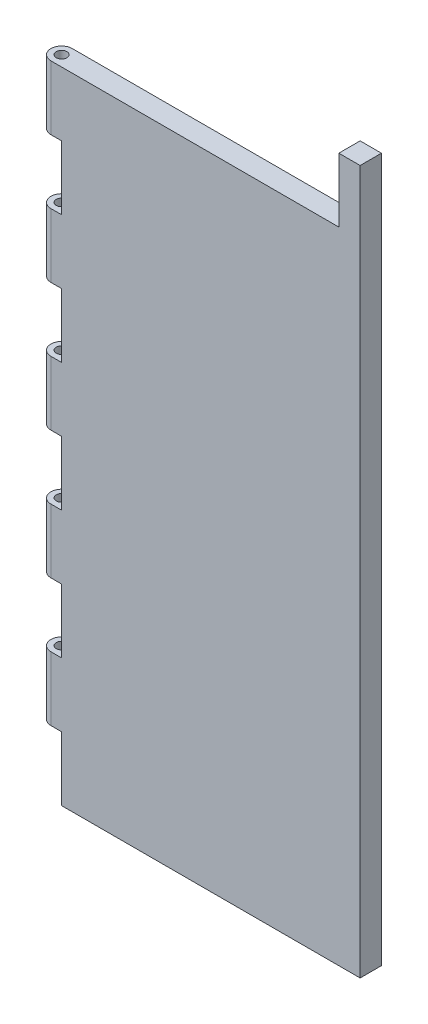
ISO-10303-21;
HEADER;
FILE_DESCRIPTION(('STEP AP214'),'2;1');
FILE_NAME('part.step','',(''),(''),'','','');
FILE_SCHEMA(('AUTOMOTIVE_DESIGN { 1 0 10303 214 1 1 1 1 }'));
ENDSEC;
DATA;
#1=APPLICATION_CONTEXT('core data for automotive mechanical design processes');
#2=APPLICATION_PROTOCOL_DEFINITION('international standard','automotive_design',2000,#1);
#3=PRODUCT_CONTEXT('',#1,'mechanical');
#4=PRODUCT('Part','Part','',(#3));
#5=PRODUCT_RELATED_PRODUCT_CATEGORY('part','',(#4));
#6=PRODUCT_DEFINITION_FORMATION('','',#4);
#7=PRODUCT_DEFINITION_CONTEXT('part definition',#1,'design');
#8=PRODUCT_DEFINITION('design','',#6,#7);
#9=PRODUCT_DEFINITION_SHAPE('','',#8);
#10=(LENGTH_UNIT() NAMED_UNIT(*) SI_UNIT(.MILLI.,.METRE.));
#11=(NAMED_UNIT(*) PLANE_ANGLE_UNIT() SI_UNIT($,.RADIAN.));
#12=(NAMED_UNIT(*) SI_UNIT($,.STERADIAN.) SOLID_ANGLE_UNIT());
#13=UNCERTAINTY_MEASURE_WITH_UNIT(LENGTH_MEASURE(1.E-05),#10,'distance_accuracy_value','');
#14=(GEOMETRIC_REPRESENTATION_CONTEXT(3) GLOBAL_UNCERTAINTY_ASSIGNED_CONTEXT((#13)) GLOBAL_UNIT_ASSIGNED_CONTEXT((#10,
#11,#12)) REPRESENTATION_CONTEXT('',''));
#15=CARTESIAN_POINT('',(0.,0.,0.));
#16=DIRECTION('',(0.,0.,1.));
#17=DIRECTION('',(1.,0.,0.));
#18=AXIS2_PLACEMENT_3D('',#15,#16,#17);
#19=CARTESIAN_POINT('',(5.,60.,5.));
#20=DIRECTION('',(0.,-1.,0.));
#21=DIRECTION('',(0.,0.,-1.));
#22=AXIS2_PLACEMENT_3D('',#19,#20,#21);
#23=CYLINDRICAL_SURFACE('',#22,5.00000000000007);
#24=DIRECTION('',(0.,-1.,0.));
#25=VECTOR('',#24,1.);
#26=CARTESIAN_POINT('',(5.,0.,10.));
#27=LINE('',#26,#25);
#28=CARTESIAN_POINT('',(5.,60.,10.));
#29=VERTEX_POINT('',#28);
#30=CARTESIAN_POINT('',(5.,30.,10.));
#31=VERTEX_POINT('',#30);
#32=EDGE_CURVE('E288',#29,#31,#27,.T.);
#33=ORIENTED_EDGE('',*,*,#32,.F.);
#34=CARTESIAN_POINT('',(5.,60.,5.));
#35=DIRECTION('',(0.,-1.,0.));
#36=DIRECTION('',(1.,0.,0.));
#37=AXIS2_PLACEMENT_3D('',#34,#35,#36);
#38=CIRCLE('',#37,5.00000000000007);
#39=CARTESIAN_POINT('',(5.,60.,0.));
#40=VERTEX_POINT('',#39);
#41=EDGE_CURVE('E43',#40,#29,#38,.F.);
#42=ORIENTED_EDGE('',*,*,#41,.F.);
#43=DIRECTION('',(0.,1.,0.));
#44=VECTOR('',#43,1.);
#45=CARTESIAN_POINT('',(5.,60.,0.));
#46=LINE('',#45,#44);
#47=CARTESIAN_POINT('',(5.,30.,0.));
#48=VERTEX_POINT('',#47);
#49=EDGE_CURVE('E291',#48,#40,#46,.T.);
#50=ORIENTED_EDGE('',*,*,#49,.F.);
#51=CARTESIAN_POINT('',(5.,30.,5.));
#52=DIRECTION('',(0.,1.,0.));
#53=DIRECTION('',(0.,0.,1.));
#54=AXIS2_PLACEMENT_3D('',#51,#52,#53);
#55=CIRCLE('',#54,5.00000000000007);
#56=EDGE_CURVE('E11',#31,#48,#55,.F.);
#57=ORIENTED_EDGE('',*,*,#56,.F.);
#58=EDGE_LOOP('',(#33,#42,#50,#57));
#59=FACE_BOUND('',#58,.T.);
#60=ADVANCED_FACE('F35',(#59),#23,.T.);
#61=CARTESIAN_POINT('',(5.,120.,5.));
#62=DIRECTION('',(0.,-1.,0.));
#63=DIRECTION('',(0.,0.,-1.));
#64=AXIS2_PLACEMENT_3D('',#61,#62,#63);
#65=CYLINDRICAL_SURFACE('',#64,5.00000000000014);
#66=DIRECTION('',(0.,-1.,0.));
#67=VECTOR('',#66,1.);
#68=CARTESIAN_POINT('',(5.,0.,10.));
#69=LINE('',#68,#67);
#70=CARTESIAN_POINT('',(5.,120.,10.));
#71=VERTEX_POINT('',#70);
#72=CARTESIAN_POINT('',(5.,90.,10.));
#73=VERTEX_POINT('',#72);
#74=EDGE_CURVE('E278',#71,#73,#69,.T.);
#75=ORIENTED_EDGE('',*,*,#74,.F.);
#76=CARTESIAN_POINT('',(5.,120.,5.));
#77=DIRECTION('',(0.,-1.,0.));
#78=DIRECTION('',(1.,0.,0.));
#79=AXIS2_PLACEMENT_3D('',#76,#77,#78);
#80=CIRCLE('',#79,5.00000000000014);
#81=CARTESIAN_POINT('',(5.,120.,0.));
#82=VERTEX_POINT('',#81);
#83=EDGE_CURVE('E284',#82,#71,#80,.F.);
#84=ORIENTED_EDGE('',*,*,#83,.F.);
#85=DIRECTION('',(0.,1.,0.));
#86=VECTOR('',#85,1.);
#87=CARTESIAN_POINT('',(5.,120.,0.));
#88=LINE('',#87,#86);
#89=CARTESIAN_POINT('',(5.,90.,0.));
#90=VERTEX_POINT('',#89);
#91=EDGE_CURVE('E281',#90,#82,#88,.T.);
#92=ORIENTED_EDGE('',*,*,#91,.F.);
#93=CARTESIAN_POINT('',(5.,90.,5.));
#94=DIRECTION('',(0.,1.,0.));
#95=DIRECTION('',(-1.,0.,0.));
#96=AXIS2_PLACEMENT_3D('',#93,#94,#95);
#97=CIRCLE('',#96,5.00000000000014);
#98=EDGE_CURVE('E286',#73,#90,#97,.F.);
#99=ORIENTED_EDGE('',*,*,#98,.F.);
#100=EDGE_LOOP('',(#75,#84,#92,#99));
#101=FACE_BOUND('',#100,.T.);
#102=ADVANCED_FACE('F451',(#101),#65,.T.);
#103=CARTESIAN_POINT('',(5.,180.,5.));
#104=DIRECTION('',(0.,-1.,0.));
#105=DIRECTION('',(0.,0.,-1.));
#106=AXIS2_PLACEMENT_3D('',#103,#104,#105);
#107=CYLINDRICAL_SURFACE('',#106,5.00000000000021);
#108=DIRECTION('',(0.,-1.,0.));
#109=VECTOR('',#108,1.);
#110=CARTESIAN_POINT('',(5.,0.,10.));
#111=LINE('',#110,#109);
#112=CARTESIAN_POINT('',(5.,180.,10.));
#113=VERTEX_POINT('',#112);
#114=CARTESIAN_POINT('',(5.,150.,10.));
#115=VERTEX_POINT('',#114);
#116=EDGE_CURVE('E268',#113,#115,#111,.T.);
#117=ORIENTED_EDGE('',*,*,#116,.F.);
#118=CARTESIAN_POINT('',(5.,180.,5.));
#119=DIRECTION('',(0.,-1.,0.));
#120=DIRECTION('',(1.,0.,0.));
#121=AXIS2_PLACEMENT_3D('',#118,#119,#120);
#122=CIRCLE('',#121,5.00000000000021);
#123=CARTESIAN_POINT('',(5.,180.,0.));
#124=VERTEX_POINT('',#123);
#125=EDGE_CURVE('E274',#124,#113,#122,.F.);
#126=ORIENTED_EDGE('',*,*,#125,.F.);
#127=DIRECTION('',(0.,1.,0.));
#128=VECTOR('',#127,1.);
#129=CARTESIAN_POINT('',(5.,180.,0.));
#130=LINE('',#129,#128);
#131=CARTESIAN_POINT('',(5.,150.,0.));
#132=VERTEX_POINT('',#131);
#133=EDGE_CURVE('E271',#132,#124,#130,.T.);
#134=ORIENTED_EDGE('',*,*,#133,.F.);
#135=CARTESIAN_POINT('',(5.,150.,5.));
#136=DIRECTION('',(0.,1.,0.));
#137=DIRECTION('',(-1.,0.,0.));
#138=AXIS2_PLACEMENT_3D('',#135,#136,#137);
#139=CIRCLE('',#138,5.00000000000021);
#140=EDGE_CURVE('E276',#115,#132,#139,.F.);
#141=ORIENTED_EDGE('',*,*,#140,.F.);
#142=EDGE_LOOP('',(#117,#126,#134,#141));
#143=FACE_BOUND('',#142,.T.);
#144=ADVANCED_FACE('F435',(#143),#107,.T.);
#145=CARTESIAN_POINT('',(5.,240.,5.));
#146=DIRECTION('',(0.,-1.,0.));
#147=DIRECTION('',(0.,0.,-1.));
#148=AXIS2_PLACEMENT_3D('',#145,#146,#147);
#149=CYLINDRICAL_SURFACE('',#148,5.00000000000027);
#150=DIRECTION('',(0.,-1.,0.));
#151=VECTOR('',#150,1.);
#152=CARTESIAN_POINT('',(5.,0.,10.));
#153=LINE('',#152,#151);
#154=CARTESIAN_POINT('',(5.,240.,10.));
#155=VERTEX_POINT('',#154);
#156=CARTESIAN_POINT('',(5.,210.,10.));
#157=VERTEX_POINT('',#156);
#158=EDGE_CURVE('E258',#155,#157,#153,.T.);
#159=ORIENTED_EDGE('',*,*,#158,.F.);
#160=CARTESIAN_POINT('',(5.,240.,5.));
#161=DIRECTION('',(0.,-1.,0.));
#162=DIRECTION('',(1.,0.,0.));
#163=AXIS2_PLACEMENT_3D('',#160,#161,#162);
#164=CIRCLE('',#163,5.00000000000027);
#165=CARTESIAN_POINT('',(5.,240.,0.));
#166=VERTEX_POINT('',#165);
#167=EDGE_CURVE('E264',#166,#155,#164,.F.);
#168=ORIENTED_EDGE('',*,*,#167,.F.);
#169=DIRECTION('',(0.,1.,0.));
#170=VECTOR('',#169,1.);
#171=CARTESIAN_POINT('',(5.,240.,0.));
#172=LINE('',#171,#170);
#173=CARTESIAN_POINT('',(5.,210.,0.));
#174=VERTEX_POINT('',#173);
#175=EDGE_CURVE('E261',#174,#166,#172,.T.);
#176=ORIENTED_EDGE('',*,*,#175,.F.);
#177=CARTESIAN_POINT('',(5.,210.,5.));
#178=DIRECTION('',(0.,1.,0.));
#179=DIRECTION('',(-1.,0.,0.));
#180=AXIS2_PLACEMENT_3D('',#177,#178,#179);
#181=CIRCLE('',#180,5.00000000000027);
#182=EDGE_CURVE('E266',#157,#174,#181,.F.);
#183=ORIENTED_EDGE('',*,*,#182,.F.);
#184=EDGE_LOOP('',(#159,#168,#176,#183));
#185=FACE_BOUND('',#184,.T.);
#186=ADVANCED_FACE('F417',(#185),#149,.T.);
#187=CARTESIAN_POINT('',(5.,300.,5.));
#188=DIRECTION('',(0.,-1.,0.));
#189=DIRECTION('',(0.,0.,-1.));
#190=AXIS2_PLACEMENT_3D('',#187,#188,#189);
#191=CYLINDRICAL_SURFACE('',#190,5.);
#192=DIRECTION('',(0.,-1.,0.));
#193=VECTOR('',#192,1.);
#194=CARTESIAN_POINT('',(5.,0.,10.));
#195=LINE('',#194,#193);
#196=CARTESIAN_POINT('',(5.,300.,10.));
#197=VERTEX_POINT('',#196);
#198=CARTESIAN_POINT('',(5.,270.,10.));
#199=VERTEX_POINT('',#198);
#200=EDGE_CURVE('E243',#197,#199,#195,.T.);
#201=ORIENTED_EDGE('',*,*,#200,.F.);
#202=CARTESIAN_POINT('',(5.,300.,5.));
#203=DIRECTION('',(0.,-1.,0.));
#204=DIRECTION('',(0.,0.,-1.));
#205=AXIS2_PLACEMENT_3D('',#202,#203,#204);
#206=CIRCLE('',#205,5.);
#207=CARTESIAN_POINT('',(5.,300.,0.));
#208=VERTEX_POINT('',#207);
#209=EDGE_CURVE('E254',#208,#197,#206,.F.);
#210=ORIENTED_EDGE('',*,*,#209,.F.);
#211=DIRECTION('',(0.,1.,0.));
#212=VECTOR('',#211,1.);
#213=CARTESIAN_POINT('',(5.,300.,0.));
#214=LINE('',#213,#212);
#215=CARTESIAN_POINT('',(5.,270.,0.));
#216=VERTEX_POINT('',#215);
#217=EDGE_CURVE('E251',#216,#208,#214,.T.);
#218=ORIENTED_EDGE('',*,*,#217,.F.);
#219=CARTESIAN_POINT('',(5.,270.,5.));
#220=DIRECTION('',(0.,1.,0.));
#221=DIRECTION('',(-1.,0.,0.));
#222=AXIS2_PLACEMENT_3D('',#219,#220,#221);
#223=CIRCLE('',#222,5.);
#224=EDGE_CURVE('E256',#199,#216,#223,.F.);
#225=ORIENTED_EDGE('',*,*,#224,.F.);
#226=EDGE_LOOP('',(#201,#210,#218,#225));
#227=FACE_BOUND('',#226,.T.);
#228=ADVANCED_FACE('F401',(#227),#191,.T.);
#229=CARTESIAN_POINT('',(0.,0.,10.));
#230=DIRECTION('',(0.,1.,0.));
#231=DIRECTION('',(0.,0.,1.));
#232=AXIS2_PLACEMENT_3D('',#229,#230,#231);
#233=PLANE('',#232);
#234=DIRECTION('',(1.,0.,0.));
#235=VECTOR('',#234,1.);
#236=CARTESIAN_POINT('',(0.,0.,10.));
#237=LINE('',#236,#235);
#238=CARTESIAN_POINT('',(10.0000000000001,0.,10.));
#239=VERTEX_POINT('',#238);
#240=CARTESIAN_POINT('',(150.,0.,10.));
#241=VERTEX_POINT('',#240);
#242=EDGE_CURVE('E212',#239,#241,#237,.T.);
#243=ORIENTED_EDGE('',*,*,#242,.F.);
#244=DIRECTION('',(0.,0.,1.));
#245=VECTOR('',#244,1.);
#246=CARTESIAN_POINT('',(10.0000000000001,0.,0.));
#247=LINE('',#246,#245);
#248=CARTESIAN_POINT('',(10.0000000000001,0.,0.));
#249=VERTEX_POINT('',#248);
#250=EDGE_CURVE('E197',#249,#239,#247,.T.);
#251=ORIENTED_EDGE('',*,*,#250,.F.);
#252=DIRECTION('',(1.,0.,0.));
#253=VECTOR('',#252,1.);
#254=CARTESIAN_POINT('',(0.,0.,0.));
#255=LINE('',#254,#253);
#256=CARTESIAN_POINT('',(150.,0.,0.));
#257=VERTEX_POINT('',#256);
#258=EDGE_CURVE('E210',#249,#257,#255,.T.);
#259=ORIENTED_EDGE('',*,*,#258,.T.);
#260=DIRECTION('',(0.,0.,-1.));
#261=VECTOR('',#260,1.);
#262=CARTESIAN_POINT('',(150.,0.,10.));
#263=LINE('',#262,#261);
#264=EDGE_CURVE('E241',#241,#257,#263,.T.);
#265=ORIENTED_EDGE('',*,*,#264,.F.);
#266=EDGE_LOOP('',(#243,#251,#259,#265));
#267=FACE_BOUND('',#266,.T.);
#268=ADVANCED_FACE('F208',(#267),#233,.F.);
#269=CARTESIAN_POINT('',(150.,206.308677980374,10.));
#270=DIRECTION('',(-1.,0.,0.));
#271=DIRECTION('',(0.,0.,1.));
#272=AXIS2_PLACEMENT_3D('',#269,#270,#271);
#273=PLANE('',#272);
#274=DIRECTION('',(0.,1.,0.));
#275=VECTOR('',#274,1.);
#276=CARTESIAN_POINT('',(150.,206.308677980374,0.));
#277=LINE('',#276,#275);
#278=CARTESIAN_POINT('',(150.,330.,0.));
#279=VERTEX_POINT('',#278);
#280=EDGE_CURVE('E216',#257,#279,#277,.T.);
#281=ORIENTED_EDGE('',*,*,#280,.T.);
#282=DIRECTION('',(0.,0.,-1.));
#283=VECTOR('',#282,1.);
#284=CARTESIAN_POINT('',(150.,330.,10.));
#285=LINE('',#284,#283);
#286=CARTESIAN_POINT('',(150.,330.,10.));
#287=VERTEX_POINT('',#286);
#288=EDGE_CURVE('E238',#287,#279,#285,.T.);
#289=ORIENTED_EDGE('',*,*,#288,.F.);
#290=DIRECTION('',(0.,1.,0.));
#291=VECTOR('',#290,1.);
#292=CARTESIAN_POINT('',(150.,0.,10.));
#293=LINE('',#292,#291);
#294=EDGE_CURVE('E386',#241,#287,#293,.T.);
#295=ORIENTED_EDGE('',*,*,#294,.F.);
#296=ORIENTED_EDGE('',*,*,#264,.T.);
#297=EDGE_LOOP('',(#281,#289,#295,#296));
#298=FACE_BOUND('',#297,.T.);
#299=ADVANCED_FACE('F536',(#298),#273,.F.);
#300=CARTESIAN_POINT('',(150.,330.,10.));
#301=DIRECTION('',(0.,-1.,0.));
#302=DIRECTION('',(0.,0.,-1.));
#303=AXIS2_PLACEMENT_3D('',#300,#301,#302);
#304=PLANE('',#303);
#305=DIRECTION('',(-1.,0.,0.));
#306=VECTOR('',#305,1.);
#307=CARTESIAN_POINT('',(150.,330.,0.));
#308=LINE('',#307,#306);
#309=CARTESIAN_POINT('',(140.,330.,0.));
#310=VERTEX_POINT('',#309);
#311=EDGE_CURVE('E219',#279,#310,#308,.T.);
#312=ORIENTED_EDGE('',*,*,#311,.T.);
#313=DIRECTION('',(0.,0.,-1.));
#314=VECTOR('',#313,1.);
#315=CARTESIAN_POINT('',(140.,330.,10.));
#316=LINE('',#315,#314);
#317=CARTESIAN_POINT('',(140.,330.,10.));
#318=VERTEX_POINT('',#317);
#319=EDGE_CURVE('E235',#318,#310,#316,.T.);
#320=ORIENTED_EDGE('',*,*,#319,.F.);
#321=DIRECTION('',(-1.,0.,0.));
#322=VECTOR('',#321,1.);
#323=CARTESIAN_POINT('',(150.,330.,10.));
#324=LINE('',#323,#322);
#325=EDGE_CURVE('E388',#287,#318,#324,.T.);
#326=ORIENTED_EDGE('',*,*,#325,.F.);
#327=ORIENTED_EDGE('',*,*,#288,.T.);
#328=EDGE_LOOP('',(#312,#320,#326,#327));
#329=FACE_BOUND('',#328,.T.);
#330=ADVANCED_FACE('F504',(#329),#304,.F.);
#331=CARTESIAN_POINT('',(140.,300.,10.));
#332=DIRECTION('',(1.,0.,0.));
#333=DIRECTION('',(0.,0.,-1.));
#334=AXIS2_PLACEMENT_3D('',#331,#332,#333);
#335=PLANE('',#334);
#336=DIRECTION('',(0.,-1.,0.));
#337=VECTOR('',#336,1.);
#338=CARTESIAN_POINT('',(140.,300.,0.));
#339=LINE('',#338,#337);
#340=CARTESIAN_POINT('',(140.,300.,0.));
#341=VERTEX_POINT('',#340);
#342=EDGE_CURVE('E227',#310,#341,#339,.T.);
#343=ORIENTED_EDGE('',*,*,#342,.T.);
#344=DIRECTION('',(0.,0.,-1.));
#345=VECTOR('',#344,1.);
#346=CARTESIAN_POINT('',(140.,300.,10.));
#347=LINE('',#346,#345);
#348=CARTESIAN_POINT('',(140.,300.,10.));
#349=VERTEX_POINT('',#348);
#350=EDGE_CURVE('E232',#349,#341,#347,.T.);
#351=ORIENTED_EDGE('',*,*,#350,.F.);
#352=DIRECTION('',(0.,-1.,0.));
#353=VECTOR('',#352,1.);
#354=CARTESIAN_POINT('',(140.,300.,10.));
#355=LINE('',#354,#353);
#356=EDGE_CURVE('E389',#318,#349,#355,.T.);
#357=ORIENTED_EDGE('',*,*,#356,.F.);
#358=ORIENTED_EDGE('',*,*,#319,.T.);
#359=EDGE_LOOP('',(#343,#351,#357,#358));
#360=FACE_BOUND('',#359,.T.);
#361=ADVANCED_FACE('F495',(#360),#335,.F.);
#362=CARTESIAN_POINT('',(0.,300.,10.));
#363=DIRECTION('',(0.,-1.,0.));
#364=DIRECTION('',(0.,0.,-1.));
#365=AXIS2_PLACEMENT_3D('',#362,#363,#364);
#366=PLANE('',#365);
#367=CARTESIAN_POINT('',(5.,300.,5.));
#368=DIRECTION('',(0.,1.,0.));
#369=DIRECTION('',(0.,0.,1.));
#370=AXIS2_PLACEMENT_3D('',#367,#368,#369);
#371=CIRCLE('',#370,2.5);
#372=CARTESIAN_POINT('',(5.,300.,7.5));
#373=VERTEX_POINT('',#372);
#374=EDGE_CURVE('E248',#373,#373,#371,.T.);
#375=ORIENTED_EDGE('',*,*,#374,.F.);
#376=EDGE_LOOP('',(#375));
#377=FACE_BOUND('',#376,.T.);
#378=DIRECTION('',(-1.,0.,0.));
#379=VECTOR('',#378,1.);
#380=CARTESIAN_POINT('',(0.,300.,0.));
#381=LINE('',#380,#379);
#382=EDGE_CURVE('E229',#341,#208,#381,.T.);
#383=ORIENTED_EDGE('',*,*,#382,.T.);
#384=ORIENTED_EDGE('',*,*,#209,.T.);
#385=DIRECTION('',(-1.,0.,0.));
#386=VECTOR('',#385,1.);
#387=CARTESIAN_POINT('',(0.,300.,10.));
#388=LINE('',#387,#386);
#389=EDGE_CURVE('E223',#349,#197,#388,.T.);
#390=ORIENTED_EDGE('',*,*,#389,.F.);
#391=ORIENTED_EDGE('',*,*,#350,.T.);
#392=EDGE_LOOP('',(#383,#384,#390,#391));
#393=FACE_BOUND('',#392,.T.);
#394=ADVANCED_FACE('F397',(#377,#393),#366,.F.);
#395=CARTESIAN_POINT('',(0.,0.,10.));
#396=DIRECTION('',(0.,0.,-1.));
#397=DIRECTION('',(-1.,0.,0.));
#398=AXIS2_PLACEMENT_3D('',#395,#396,#397);
#399=PLANE('',#398);
#400=DIRECTION('',(1.,0.,0.));
#401=VECTOR('',#400,1.);
#402=CARTESIAN_POINT('',(-2.05814939933146E-13,60.,10.));
#403=LINE('',#402,#401);
#404=CARTESIAN_POINT('',(9.9999999999999,60.,10.));
#405=VERTEX_POINT('',#404);
#406=EDGE_CURVE('E297',#29,#405,#403,.T.);
#407=ORIENTED_EDGE('',*,*,#406,.F.);
#408=ORIENTED_EDGE('',*,*,#32,.T.);
#409=DIRECTION('',(-1.,0.,0.));
#410=VECTOR('',#409,1.);
#411=CARTESIAN_POINT('',(0.,30.,10.));
#412=LINE('',#411,#410);
#413=CARTESIAN_POINT('',(10.,30.,10.));
#414=VERTEX_POINT('',#413);
#415=EDGE_CURVE('E204',#414,#31,#412,.T.);
#416=ORIENTED_EDGE('',*,*,#415,.F.);
#417=DIRECTION('',(0.,1.,0.));
#418=VECTOR('',#417,1.);
#419=CARTESIAN_POINT('',(10.0000000000001,0.,10.));
#420=LINE('',#419,#418);
#421=EDGE_CURVE('E321',#239,#414,#420,.T.);
#422=ORIENTED_EDGE('',*,*,#421,.F.);
#423=ORIENTED_EDGE('',*,*,#242,.T.);
#424=ORIENTED_EDGE('',*,*,#294,.T.);
#425=ORIENTED_EDGE('',*,*,#325,.T.);
#426=ORIENTED_EDGE('',*,*,#356,.T.);
#427=ORIENTED_EDGE('',*,*,#389,.T.);
#428=ORIENTED_EDGE('',*,*,#200,.T.);
#429=DIRECTION('',(-1.,0.,0.));
#430=VECTOR('',#429,1.);
#431=CARTESIAN_POINT('',(-8.23259759732584E-13,270.,10.));
#432=LINE('',#431,#430);
#433=CARTESIAN_POINT('',(9.99999999999918,270.,10.));
#434=VERTEX_POINT('',#433);
#435=EDGE_CURVE('E367',#434,#199,#432,.T.);
#436=ORIENTED_EDGE('',*,*,#435,.F.);
#437=DIRECTION('',(0.,1.,0.));
#438=VECTOR('',#437,1.);
#439=CARTESIAN_POINT('',(9.99999999999928,240.,10.));
#440=LINE('',#439,#438);
#441=CARTESIAN_POINT('',(9.99999999999928,240.,10.));
#442=VERTEX_POINT('',#441);
#443=EDGE_CURVE('E376',#442,#434,#440,.T.);
#444=ORIENTED_EDGE('',*,*,#443,.F.);
#445=DIRECTION('',(1.,0.,0.));
#446=VECTOR('',#445,1.);
#447=CARTESIAN_POINT('',(-8.23259759732584E-13,240.,10.));
#448=LINE('',#447,#446);
#449=EDGE_CURVE('E374',#155,#442,#448,.T.);
#450=ORIENTED_EDGE('',*,*,#449,.F.);
#451=ORIENTED_EDGE('',*,*,#158,.T.);
#452=DIRECTION('',(-1.,0.,0.));
#453=VECTOR('',#452,1.);
#454=CARTESIAN_POINT('',(-6.17444819799438E-13,210.,10.));
#455=LINE('',#454,#453);
#456=CARTESIAN_POINT('',(9.99999999999938,210.,10.));
#457=VERTEX_POINT('',#456);
#458=EDGE_CURVE('E346',#457,#157,#455,.T.);
#459=ORIENTED_EDGE('',*,*,#458,.F.);
#460=DIRECTION('',(0.,1.,0.));
#461=VECTOR('',#460,1.);
#462=CARTESIAN_POINT('',(9.99999999999948,180.,10.));
#463=LINE('',#462,#461);
#464=CARTESIAN_POINT('',(9.99999999999948,180.,10.));
#465=VERTEX_POINT('',#464);
#466=EDGE_CURVE('E355',#465,#457,#463,.T.);
#467=ORIENTED_EDGE('',*,*,#466,.F.);
#468=DIRECTION('',(1.,0.,0.));
#469=VECTOR('',#468,1.);
#470=CARTESIAN_POINT('',(-6.17444819799438E-13,180.,10.));
#471=LINE('',#470,#469);
#472=EDGE_CURVE('E353',#113,#465,#471,.T.);
#473=ORIENTED_EDGE('',*,*,#472,.F.);
#474=ORIENTED_EDGE('',*,*,#116,.T.);
#475=DIRECTION('',(-1.,0.,0.));
#476=VECTOR('',#475,1.);
#477=CARTESIAN_POINT('',(-4.11629879866292E-13,150.,10.));
#478=LINE('',#477,#476);
#479=CARTESIAN_POINT('',(9.99999999999959,150.,10.));
#480=VERTEX_POINT('',#479);
#481=EDGE_CURVE('E327',#480,#115,#478,.T.);
#482=ORIENTED_EDGE('',*,*,#481,.F.);
#483=DIRECTION('',(0.,1.,0.));
#484=VECTOR('',#483,1.);
#485=CARTESIAN_POINT('',(9.99999999999969,120.,10.));
#486=LINE('',#485,#484);
#487=CARTESIAN_POINT('',(9.99999999999969,120.,10.));
#488=VERTEX_POINT('',#487);
#489=EDGE_CURVE('E335',#488,#480,#486,.T.);
#490=ORIENTED_EDGE('',*,*,#489,.F.);
#491=DIRECTION('',(1.,0.,0.));
#492=VECTOR('',#491,1.);
#493=CARTESIAN_POINT('',(-4.11629879866292E-13,120.,10.));
#494=LINE('',#493,#492);
#495=EDGE_CURVE('E333',#71,#488,#494,.T.);
#496=ORIENTED_EDGE('',*,*,#495,.F.);
#497=ORIENTED_EDGE('',*,*,#74,.T.);
#498=DIRECTION('',(-1.,0.,0.));
#499=VECTOR('',#498,1.);
#500=CARTESIAN_POINT('',(-2.05814939933146E-13,90.,10.));
#501=LINE('',#500,#499);
#502=CARTESIAN_POINT('',(9.99999999999979,90.,10.));
#503=VERTEX_POINT('',#502);
#504=EDGE_CURVE('E309',#503,#73,#501,.T.);
#505=ORIENTED_EDGE('',*,*,#504,.F.);
#506=DIRECTION('',(0.,1.,0.));
#507=VECTOR('',#506,1.);
#508=CARTESIAN_POINT('',(9.9999999999999,60.,10.));
#509=LINE('',#508,#507);
#510=EDGE_CURVE('E306',#405,#503,#509,.T.);
#511=ORIENTED_EDGE('',*,*,#510,.F.);
#512=EDGE_LOOP('',(#407,#408,#416,#422,#423,#424,#425,#426,#427,#428,#436,#444,#450,#451,#459,
#467,#473,#474,#482,#490,#496,#497,#505,#511));
#513=FACE_BOUND('',#512,.T.);
#514=ADVANCED_FACE('F303',(#513),#399,.F.);
#515=CARTESIAN_POINT('',(0.,0.,0.));
#516=DIRECTION('',(0.,0.,-1.));
#517=DIRECTION('',(-1.,0.,0.));
#518=AXIS2_PLACEMENT_3D('',#515,#516,#517);
#519=PLANE('',#518);
#520=DIRECTION('',(-1.,0.,0.));
#521=VECTOR('',#520,1.);
#522=CARTESIAN_POINT('',(0.,30.,0.));
#523=LINE('',#522,#521);
#524=CARTESIAN_POINT('',(10.,30.,0.));
#525=VERTEX_POINT('',#524);
#526=EDGE_CURVE('E203',#525,#48,#523,.T.);
#527=ORIENTED_EDGE('',*,*,#526,.T.);
#528=ORIENTED_EDGE('',*,*,#49,.T.);
#529=DIRECTION('',(1.,0.,0.));
#530=VECTOR('',#529,1.);
#531=CARTESIAN_POINT('',(-2.05814939933146E-13,60.,0.));
#532=LINE('',#531,#530);
#533=CARTESIAN_POINT('',(9.9999999999999,60.,0.));
#534=VERTEX_POINT('',#533);
#535=EDGE_CURVE('E299',#40,#534,#532,.T.);
#536=ORIENTED_EDGE('',*,*,#535,.T.);
#537=DIRECTION('',(0.,1.,0.));
#538=VECTOR('',#537,1.);
#539=CARTESIAN_POINT('',(9.9999999999999,60.,0.));
#540=LINE('',#539,#538);
#541=CARTESIAN_POINT('',(9.99999999999979,90.,0.));
#542=VERTEX_POINT('',#541);
#543=EDGE_CURVE('E460',#534,#542,#540,.T.);
#544=ORIENTED_EDGE('',*,*,#543,.T.);
#545=DIRECTION('',(-1.,0.,0.));
#546=VECTOR('',#545,1.);
#547=CARTESIAN_POINT('',(-2.05814939933146E-13,90.,0.));
#548=LINE('',#547,#546);
#549=EDGE_CURVE('E314',#542,#90,#548,.T.);
#550=ORIENTED_EDGE('',*,*,#549,.T.);
#551=ORIENTED_EDGE('',*,*,#91,.T.);
#552=DIRECTION('',(1.,0.,0.));
#553=VECTOR('',#552,1.);
#554=CARTESIAN_POINT('',(-4.11629879866292E-13,120.,0.));
#555=LINE('',#554,#553);
#556=CARTESIAN_POINT('',(9.99999999999969,120.,0.));
#557=VERTEX_POINT('',#556);
#558=EDGE_CURVE('E324',#82,#557,#555,.T.);
#559=ORIENTED_EDGE('',*,*,#558,.T.);
#560=DIRECTION('',(0.,1.,0.));
#561=VECTOR('',#560,1.);
#562=CARTESIAN_POINT('',(9.99999999999969,120.,0.));
#563=LINE('',#562,#561);
#564=CARTESIAN_POINT('',(9.99999999999959,150.,0.));
#565=VERTEX_POINT('',#564);
#566=EDGE_CURVE('E326',#557,#565,#563,.T.);
#567=ORIENTED_EDGE('',*,*,#566,.T.);
#568=DIRECTION('',(-1.,0.,0.));
#569=VECTOR('',#568,1.);
#570=CARTESIAN_POINT('',(-4.11629879866292E-13,150.,0.));
#571=LINE('',#570,#569);
#572=EDGE_CURVE('E330',#565,#132,#571,.T.);
#573=ORIENTED_EDGE('',*,*,#572,.T.);
#574=ORIENTED_EDGE('',*,*,#133,.T.);
#575=DIRECTION('',(1.,0.,0.));
#576=VECTOR('',#575,1.);
#577=CARTESIAN_POINT('',(-6.17444819799438E-13,180.,0.));
#578=LINE('',#577,#576);
#579=CARTESIAN_POINT('',(9.99999999999948,180.,0.));
#580=VERTEX_POINT('',#579);
#581=EDGE_CURVE('E343',#124,#580,#578,.T.);
#582=ORIENTED_EDGE('',*,*,#581,.T.);
#583=DIRECTION('',(0.,1.,0.));
#584=VECTOR('',#583,1.);
#585=CARTESIAN_POINT('',(9.99999999999948,180.,0.));
#586=LINE('',#585,#584);
#587=CARTESIAN_POINT('',(9.99999999999938,210.,0.));
#588=VERTEX_POINT('',#587);
#589=EDGE_CURVE('E345',#580,#588,#586,.T.);
#590=ORIENTED_EDGE('',*,*,#589,.T.);
#591=DIRECTION('',(-1.,0.,0.));
#592=VECTOR('',#591,1.);
#593=CARTESIAN_POINT('',(-6.17444819799438E-13,210.,0.));
#594=LINE('',#593,#592);
#595=EDGE_CURVE('E349',#588,#174,#594,.T.);
#596=ORIENTED_EDGE('',*,*,#595,.T.);
#597=ORIENTED_EDGE('',*,*,#175,.T.);
#598=DIRECTION('',(1.,0.,0.));
#599=VECTOR('',#598,1.);
#600=CARTESIAN_POINT('',(-8.23259759732584E-13,240.,0.));
#601=LINE('',#600,#599);
#602=CARTESIAN_POINT('',(9.99999999999928,240.,0.));
#603=VERTEX_POINT('',#602);
#604=EDGE_CURVE('E364',#166,#603,#601,.T.);
#605=ORIENTED_EDGE('',*,*,#604,.T.);
#606=DIRECTION('',(0.,1.,0.));
#607=VECTOR('',#606,1.);
#608=CARTESIAN_POINT('',(9.99999999999928,240.,0.));
#609=LINE('',#608,#607);
#610=CARTESIAN_POINT('',(9.99999999999918,270.,0.));
#611=VERTEX_POINT('',#610);
#612=EDGE_CURVE('E366',#603,#611,#609,.T.);
#613=ORIENTED_EDGE('',*,*,#612,.T.);
#614=DIRECTION('',(-1.,0.,0.));
#615=VECTOR('',#614,1.);
#616=CARTESIAN_POINT('',(-8.23259759732584E-13,270.,0.));
#617=LINE('',#616,#615);
#618=EDGE_CURVE('E370',#611,#216,#617,.T.);
#619=ORIENTED_EDGE('',*,*,#618,.T.);
#620=ORIENTED_EDGE('',*,*,#217,.T.);
#621=ORIENTED_EDGE('',*,*,#382,.F.);
#622=ORIENTED_EDGE('',*,*,#342,.F.);
#623=ORIENTED_EDGE('',*,*,#311,.F.);
#624=ORIENTED_EDGE('',*,*,#280,.F.);
#625=ORIENTED_EDGE('',*,*,#258,.F.);
#626=DIRECTION('',(0.,1.,0.));
#627=VECTOR('',#626,1.);
#628=CARTESIAN_POINT('',(10.0000000000001,0.,0.));
#629=LINE('',#628,#627);
#630=EDGE_CURVE('E193',#249,#525,#629,.T.);
#631=ORIENTED_EDGE('',*,*,#630,.T.);
#632=EDGE_LOOP('',(#527,#528,#536,#544,#550,#551,#559,#567,#573,#574,#582,#590,#596,#597,#605,
#613,#619,#620,#621,#622,#623,#624,#625,#631));
#633=FACE_BOUND('',#632,.T.);
#634=ADVANCED_FACE('F214',(#633),#519,.T.);
#635=CARTESIAN_POINT('',(-8.23259759732584E-13,270.,0.));
#636=DIRECTION('',(0.,1.,0.));
#637=DIRECTION('',(-1.,0.,0.));
#638=AXIS2_PLACEMENT_3D('',#635,#636,#637);
#639=PLANE('',#638);
#640=CARTESIAN_POINT('',(5.,270.,5.));
#641=DIRECTION('',(0.,1.,0.));
#642=DIRECTION('',(-1.,0.,0.));
#643=AXIS2_PLACEMENT_3D('',#640,#641,#642);
#644=CIRCLE('',#643,2.5);
#645=CARTESIAN_POINT('',(2.5,270.,5.));
#646=VERTEX_POINT('',#645);
#647=EDGE_CURVE('E377',#646,#646,#644,.T.);
#648=ORIENTED_EDGE('',*,*,#647,.T.);
#649=EDGE_LOOP('',(#648));
#650=FACE_BOUND('',#649,.T.);
#651=ORIENTED_EDGE('',*,*,#435,.T.);
#652=ORIENTED_EDGE('',*,*,#224,.T.);
#653=ORIENTED_EDGE('',*,*,#618,.F.);
#654=DIRECTION('',(0.,0.,1.));
#655=VECTOR('',#654,1.);
#656=CARTESIAN_POINT('',(9.99999999999918,270.,0.));
#657=LINE('',#656,#655);
#658=EDGE_CURVE('E356',#611,#434,#657,.T.);
#659=ORIENTED_EDGE('',*,*,#658,.T.);
#660=EDGE_LOOP('',(#651,#652,#653,#659));
#661=FACE_BOUND('',#660,.T.);
#662=ADVANCED_FACE('F404',(#650,#661),#639,.F.);
#663=CARTESIAN_POINT('',(9.99999999999928,240.,0.));
#664=DIRECTION('',(1.,0.,0.));
#665=DIRECTION('',(0.,1.,0.));
#666=AXIS2_PLACEMENT_3D('',#663,#664,#665);
#667=PLANE('',#666);
#668=ORIENTED_EDGE('',*,*,#443,.T.);
#669=ORIENTED_EDGE('',*,*,#658,.F.);
#670=ORIENTED_EDGE('',*,*,#612,.F.);
#671=DIRECTION('',(0.,0.,1.));
#672=VECTOR('',#671,1.);
#673=CARTESIAN_POINT('',(9.99999999999928,240.,0.));
#674=LINE('',#673,#672);
#675=EDGE_CURVE('E373',#603,#442,#674,.T.);
#676=ORIENTED_EDGE('',*,*,#675,.T.);
#677=EDGE_LOOP('',(#668,#669,#670,#676));
#678=FACE_BOUND('',#677,.T.);
#679=ADVANCED_FACE('F408',(#678),#667,.F.);
#680=CARTESIAN_POINT('',(-8.23259759732584E-13,240.,0.));
#681=DIRECTION('',(0.,-1.,0.));
#682=DIRECTION('',(1.,0.,0.));
#683=AXIS2_PLACEMENT_3D('',#680,#681,#682);
#684=PLANE('',#683);
#685=CARTESIAN_POINT('',(5.,240.,5.));
#686=DIRECTION('',(0.,-1.,0.));
#687=DIRECTION('',(1.,0.,0.));
#688=AXIS2_PLACEMENT_3D('',#685,#686,#687);
#689=CIRCLE('',#688,2.5);
#690=CARTESIAN_POINT('',(7.5,240.,5.));
#691=VERTEX_POINT('',#690);
#692=EDGE_CURVE('E468',#691,#691,#689,.T.);
#693=ORIENTED_EDGE('',*,*,#692,.T.);
#694=EDGE_LOOP('',(#693));
#695=FACE_BOUND('',#694,.T.);
#696=ORIENTED_EDGE('',*,*,#604,.F.);
#697=ORIENTED_EDGE('',*,*,#167,.T.);
#698=ORIENTED_EDGE('',*,*,#449,.T.);
#699=ORIENTED_EDGE('',*,*,#675,.F.);
#700=EDGE_LOOP('',(#696,#697,#698,#699));
#701=FACE_BOUND('',#700,.T.);
#702=ADVANCED_FACE('F413',(#695,#701),#684,.F.);
#703=CARTESIAN_POINT('',(-6.17444819799438E-13,210.,0.));
#704=DIRECTION('',(0.,1.,0.));
#705=DIRECTION('',(-1.,0.,0.));
#706=AXIS2_PLACEMENT_3D('',#703,#704,#705);
#707=PLANE('',#706);
#708=CARTESIAN_POINT('',(5.,210.,5.));
#709=DIRECTION('',(0.,1.,0.));
#710=DIRECTION('',(-1.,0.,0.));
#711=AXIS2_PLACEMENT_3D('',#708,#709,#710);
#712=CIRCLE('',#711,2.5);
#713=CARTESIAN_POINT('',(2.5,210.,5.));
#714=VERTEX_POINT('',#713);
#715=EDGE_CURVE('E471',#714,#714,#712,.T.);
#716=ORIENTED_EDGE('',*,*,#715,.T.);
#717=EDGE_LOOP('',(#716));
#718=FACE_BOUND('',#717,.T.);
#719=ORIENTED_EDGE('',*,*,#458,.T.);
#720=ORIENTED_EDGE('',*,*,#182,.T.);
#721=ORIENTED_EDGE('',*,*,#595,.F.);
#722=DIRECTION('',(0.,0.,1.));
#723=VECTOR('',#722,1.);
#724=CARTESIAN_POINT('',(9.99999999999938,210.,0.));
#725=LINE('',#724,#723);
#726=EDGE_CURVE('E336',#588,#457,#725,.T.);
#727=ORIENTED_EDGE('',*,*,#726,.T.);
#728=EDGE_LOOP('',(#719,#720,#721,#727));
#729=FACE_BOUND('',#728,.T.);
#730=ADVANCED_FACE('F421',(#718,#729),#707,.F.);
#731=CARTESIAN_POINT('',(9.99999999999948,180.,0.));
#732=DIRECTION('',(1.,0.,0.));
#733=DIRECTION('',(0.,1.,0.));
#734=AXIS2_PLACEMENT_3D('',#731,#732,#733);
#735=PLANE('',#734);
#736=ORIENTED_EDGE('',*,*,#466,.T.);
#737=ORIENTED_EDGE('',*,*,#726,.F.);
#738=ORIENTED_EDGE('',*,*,#589,.F.);
#739=DIRECTION('',(0.,0.,1.));
#740=VECTOR('',#739,1.);
#741=CARTESIAN_POINT('',(9.99999999999948,180.,0.));
#742=LINE('',#741,#740);
#743=EDGE_CURVE('E352',#580,#465,#742,.T.);
#744=ORIENTED_EDGE('',*,*,#743,.T.);
#745=EDGE_LOOP('',(#736,#737,#738,#744));
#746=FACE_BOUND('',#745,.T.);
#747=ADVANCED_FACE('F425',(#746),#735,.F.);
#748=CARTESIAN_POINT('',(-6.17444819799438E-13,180.,0.));
#749=DIRECTION('',(0.,-1.,0.));
#750=DIRECTION('',(1.,0.,0.));
#751=AXIS2_PLACEMENT_3D('',#748,#749,#750);
#752=PLANE('',#751);
#753=CARTESIAN_POINT('',(5.,180.,5.));
#754=DIRECTION('',(0.,-1.,0.));
#755=DIRECTION('',(1.,0.,0.));
#756=AXIS2_PLACEMENT_3D('',#753,#754,#755);
#757=CIRCLE('',#756,2.5);
#758=CARTESIAN_POINT('',(7.5,180.,5.));
#759=VERTEX_POINT('',#758);
#760=EDGE_CURVE('E474',#759,#759,#757,.T.);
#761=ORIENTED_EDGE('',*,*,#760,.T.);
#762=EDGE_LOOP('',(#761));
#763=FACE_BOUND('',#762,.T.);
#764=ORIENTED_EDGE('',*,*,#581,.F.);
#765=ORIENTED_EDGE('',*,*,#125,.T.);
#766=ORIENTED_EDGE('',*,*,#472,.T.);
#767=ORIENTED_EDGE('',*,*,#743,.F.);
#768=EDGE_LOOP('',(#764,#765,#766,#767));
#769=FACE_BOUND('',#768,.T.);
#770=ADVANCED_FACE('F432',(#763,#769),#752,.F.);
#771=CARTESIAN_POINT('',(-4.11629879866292E-13,150.,0.));
#772=DIRECTION('',(0.,1.,0.));
#773=DIRECTION('',(-1.,0.,0.));
#774=AXIS2_PLACEMENT_3D('',#771,#772,#773);
#775=PLANE('',#774);
#776=CARTESIAN_POINT('',(5.,150.,5.));
#777=DIRECTION('',(0.,1.,0.));
#778=DIRECTION('',(-1.,0.,0.));
#779=AXIS2_PLACEMENT_3D('',#776,#777,#778);
#780=CIRCLE('',#779,2.5);
#781=CARTESIAN_POINT('',(2.5,150.,5.));
#782=VERTEX_POINT('',#781);
#783=EDGE_CURVE('E477',#782,#782,#780,.T.);
#784=ORIENTED_EDGE('',*,*,#783,.T.);
#785=EDGE_LOOP('',(#784));
#786=FACE_BOUND('',#785,.T.);
#787=ORIENTED_EDGE('',*,*,#481,.T.);
#788=ORIENTED_EDGE('',*,*,#140,.T.);
#789=ORIENTED_EDGE('',*,*,#572,.F.);
#790=DIRECTION('',(0.,0.,1.));
#791=VECTOR('',#790,1.);
#792=CARTESIAN_POINT('',(9.99999999999959,150.,0.));
#793=LINE('',#792,#791);
#794=EDGE_CURVE('E307',#565,#480,#793,.T.);
#795=ORIENTED_EDGE('',*,*,#794,.T.);
#796=EDGE_LOOP('',(#787,#788,#789,#795));
#797=FACE_BOUND('',#796,.T.);
#798=ADVANCED_FACE('F438',(#786,#797),#775,.F.);
#799=CARTESIAN_POINT('',(9.99999999999969,120.,0.));
#800=DIRECTION('',(1.,0.,0.));
#801=DIRECTION('',(0.,1.,0.));
#802=AXIS2_PLACEMENT_3D('',#799,#800,#801);
#803=PLANE('',#802);
#804=ORIENTED_EDGE('',*,*,#489,.T.);
#805=ORIENTED_EDGE('',*,*,#794,.F.);
#806=ORIENTED_EDGE('',*,*,#566,.F.);
#807=DIRECTION('',(0.,0.,1.));
#808=VECTOR('',#807,1.);
#809=CARTESIAN_POINT('',(9.99999999999969,120.,0.));
#810=LINE('',#809,#808);
#811=EDGE_CURVE('E311',#557,#488,#810,.T.);
#812=ORIENTED_EDGE('',*,*,#811,.T.);
#813=EDGE_LOOP('',(#804,#805,#806,#812));
#814=FACE_BOUND('',#813,.T.);
#815=ADVANCED_FACE('F442',(#814),#803,.F.);
#816=CARTESIAN_POINT('',(-4.11629879866292E-13,120.,0.));
#817=DIRECTION('',(0.,-1.,0.));
#818=DIRECTION('',(1.,0.,0.));
#819=AXIS2_PLACEMENT_3D('',#816,#817,#818);
#820=PLANE('',#819);
#821=CARTESIAN_POINT('',(5.,120.,5.));
#822=DIRECTION('',(0.,-1.,0.));
#823=DIRECTION('',(1.,0.,0.));
#824=AXIS2_PLACEMENT_3D('',#821,#822,#823);
#825=CIRCLE('',#824,2.5);
#826=CARTESIAN_POINT('',(7.5,120.,5.));
#827=VERTEX_POINT('',#826);
#828=EDGE_CURVE('E480',#827,#827,#825,.T.);
#829=ORIENTED_EDGE('',*,*,#828,.T.);
#830=EDGE_LOOP('',(#829));
#831=FACE_BOUND('',#830,.T.);
#832=ORIENTED_EDGE('',*,*,#558,.F.);
#833=ORIENTED_EDGE('',*,*,#83,.T.);
#834=ORIENTED_EDGE('',*,*,#495,.T.);
#835=ORIENTED_EDGE('',*,*,#811,.F.);
#836=EDGE_LOOP('',(#832,#833,#834,#835));
#837=FACE_BOUND('',#836,.T.);
#838=ADVANCED_FACE('F447',(#831,#837),#820,.F.);
#839=CARTESIAN_POINT('',(-2.05814939933146E-13,90.,0.));
#840=DIRECTION('',(0.,1.,0.));
#841=DIRECTION('',(-1.,0.,0.));
#842=AXIS2_PLACEMENT_3D('',#839,#840,#841);
#843=PLANE('',#842);
#844=CARTESIAN_POINT('',(5.,90.,5.));
#845=DIRECTION('',(0.,1.,0.));
#846=DIRECTION('',(-1.,0.,0.));
#847=AXIS2_PLACEMENT_3D('',#844,#845,#846);
#848=CIRCLE('',#847,2.5);
#849=CARTESIAN_POINT('',(2.5,90.,5.));
#850=VERTEX_POINT('',#849);
#851=EDGE_CURVE('E483',#850,#850,#848,.T.);
#852=ORIENTED_EDGE('',*,*,#851,.T.);
#853=EDGE_LOOP('',(#852));
#854=FACE_BOUND('',#853,.T.);
#855=ORIENTED_EDGE('',*,*,#504,.T.);
#856=ORIENTED_EDGE('',*,*,#98,.T.);
#857=ORIENTED_EDGE('',*,*,#549,.F.);
#858=DIRECTION('',(0.,0.,1.));
#859=VECTOR('',#858,1.);
#860=CARTESIAN_POINT('',(9.99999999999979,90.,0.));
#861=LINE('',#860,#859);
#862=EDGE_CURVE('E319',#542,#503,#861,.T.);
#863=ORIENTED_EDGE('',*,*,#862,.T.);
#864=EDGE_LOOP('',(#855,#856,#857,#863));
#865=FACE_BOUND('',#864,.T.);
#866=ADVANCED_FACE('F453',(#854,#865),#843,.F.);
#867=CARTESIAN_POINT('',(9.9999999999999,60.,0.));
#868=DIRECTION('',(1.,0.,0.));
#869=DIRECTION('',(0.,1.,0.));
#870=AXIS2_PLACEMENT_3D('',#867,#868,#869);
#871=PLANE('',#870);
#872=ORIENTED_EDGE('',*,*,#510,.T.);
#873=ORIENTED_EDGE('',*,*,#862,.F.);
#874=ORIENTED_EDGE('',*,*,#543,.F.);
#875=DIRECTION('',(0.,0.,1.));
#876=VECTOR('',#875,1.);
#877=CARTESIAN_POINT('',(9.9999999999999,60.,0.));
#878=LINE('',#877,#876);
#879=EDGE_CURVE('E322',#534,#405,#878,.T.);
#880=ORIENTED_EDGE('',*,*,#879,.T.);
#881=EDGE_LOOP('',(#872,#873,#874,#880));
#882=FACE_BOUND('',#881,.T.);
#883=ADVANCED_FACE('F459',(#882),#871,.F.);
#884=CARTESIAN_POINT('',(-2.05814939933146E-13,60.,0.));
#885=DIRECTION('',(0.,-1.,0.));
#886=DIRECTION('',(1.,0.,0.));
#887=AXIS2_PLACEMENT_3D('',#884,#885,#886);
#888=PLANE('',#887);
#889=CARTESIAN_POINT('',(5.,60.,5.));
#890=DIRECTION('',(0.,-1.,0.));
#891=DIRECTION('',(1.,0.,0.));
#892=AXIS2_PLACEMENT_3D('',#889,#890,#891);
#893=CIRCLE('',#892,2.5);
#894=CARTESIAN_POINT('',(7.5,60.,5.));
#895=VERTEX_POINT('',#894);
#896=EDGE_CURVE('E247',#895,#895,#893,.T.);
#897=ORIENTED_EDGE('',*,*,#896,.T.);
#898=EDGE_LOOP('',(#897));
#899=FACE_BOUND('',#898,.T.);
#900=ORIENTED_EDGE('',*,*,#535,.F.);
#901=ORIENTED_EDGE('',*,*,#41,.T.);
#902=ORIENTED_EDGE('',*,*,#406,.T.);
#903=ORIENTED_EDGE('',*,*,#879,.F.);
#904=EDGE_LOOP('',(#900,#901,#902,#903));
#905=FACE_BOUND('',#904,.T.);
#906=ADVANCED_FACE('F294',(#899,#905),#888,.F.);
#907=CARTESIAN_POINT('',(0.,30.,0.));
#908=DIRECTION('',(0.,1.,0.));
#909=DIRECTION('',(0.,0.,1.));
#910=AXIS2_PLACEMENT_3D('',#907,#908,#909);
#911=PLANE('',#910);
#912=CARTESIAN_POINT('',(5.,30.,5.));
#913=DIRECTION('',(0.,1.,0.));
#914=DIRECTION('',(0.,0.,1.));
#915=AXIS2_PLACEMENT_3D('',#912,#913,#914);
#916=CIRCLE('',#915,2.5);
#917=CARTESIAN_POINT('',(5.,30.,7.5));
#918=VERTEX_POINT('',#917);
#919=EDGE_CURVE('E244',#918,#918,#916,.T.);
#920=ORIENTED_EDGE('',*,*,#919,.T.);
#921=EDGE_LOOP('',(#920));
#922=FACE_BOUND('',#921,.T.);
#923=ORIENTED_EDGE('',*,*,#415,.T.);
#924=ORIENTED_EDGE('',*,*,#56,.T.);
#925=ORIENTED_EDGE('',*,*,#526,.F.);
#926=DIRECTION('',(0.,0.,1.));
#927=VECTOR('',#926,1.);
#928=CARTESIAN_POINT('',(10.,30.,0.));
#929=LINE('',#928,#927);
#930=EDGE_CURVE('E199',#525,#414,#929,.T.);
#931=ORIENTED_EDGE('',*,*,#930,.T.);
#932=EDGE_LOOP('',(#923,#924,#925,#931));
#933=FACE_BOUND('',#932,.T.);
#934=ADVANCED_FACE('F549',(#922,#933),#911,.F.);
#935=CARTESIAN_POINT('',(10.0000000000001,0.,0.));
#936=DIRECTION('',(1.,0.,0.));
#937=DIRECTION('',(0.,1.,0.));
#938=AXIS2_PLACEMENT_3D('',#935,#936,#937);
#939=PLANE('',#938);
#940=ORIENTED_EDGE('',*,*,#421,.T.);
#941=ORIENTED_EDGE('',*,*,#930,.F.);
#942=ORIENTED_EDGE('',*,*,#630,.F.);
#943=ORIENTED_EDGE('',*,*,#250,.T.);
#944=EDGE_LOOP('',(#940,#941,#942,#943));
#945=FACE_BOUND('',#944,.T.);
#946=ADVANCED_FACE('F196',(#945),#939,.F.);
#947=CARTESIAN_POINT('',(5.,0.,5.));
#948=DIRECTION('',(0.,1.,0.));
#949=DIRECTION('',(0.,0.,1.));
#950=AXIS2_PLACEMENT_3D('',#947,#948,#949);
#951=CYLINDRICAL_SURFACE('',#950,2.5);
#952=ORIENTED_EDGE('',*,*,#919,.F.);
#953=EDGE_LOOP('',(#952));
#954=FACE_BOUND('',#953,.T.);
#955=ORIENTED_EDGE('',*,*,#896,.F.);
#956=EDGE_LOOP('',(#955));
#957=FACE_BOUND('',#956,.T.);
#958=ADVANCED_FACE('F557',(#954,#957),#951,.F.);
#959=ORIENTED_EDGE('',*,*,#851,.F.);
#960=EDGE_LOOP('',(#959));
#961=FACE_BOUND('',#960,.T.);
#962=ORIENTED_EDGE('',*,*,#828,.F.);
#963=EDGE_LOOP('',(#962));
#964=FACE_BOUND('',#963,.T.);
#965=ADVANCED_FACE('F620',(#961,#964),#951,.F.);
#966=ORIENTED_EDGE('',*,*,#783,.F.);
#967=EDGE_LOOP('',(#966));
#968=FACE_BOUND('',#967,.T.);
#969=ORIENTED_EDGE('',*,*,#760,.F.);
#970=EDGE_LOOP('',(#969));
#971=FACE_BOUND('',#970,.T.);
#972=ADVANCED_FACE('F627',(#968,#971),#951,.F.);
#973=ORIENTED_EDGE('',*,*,#715,.F.);
#974=EDGE_LOOP('',(#973));
#975=FACE_BOUND('',#974,.T.);
#976=ORIENTED_EDGE('',*,*,#692,.F.);
#977=EDGE_LOOP('',(#976));
#978=FACE_BOUND('',#977,.T.);
#979=ADVANCED_FACE('F634',(#975,#978),#951,.F.);
#980=ORIENTED_EDGE('',*,*,#374,.T.);
#981=EDGE_LOOP('',(#980));
#982=FACE_BOUND('',#981,.T.);
#983=ORIENTED_EDGE('',*,*,#647,.F.);
#984=EDGE_LOOP('',(#983));
#985=FACE_BOUND('',#984,.T.);
#986=ADVANCED_FACE('F491',(#982,#985),#951,.F.);
#987=CLOSED_SHELL('',(#60,#102,#144,#186,#228,#268,#299,#330,#361,#394,#514,#634,#662,#679,#702,
#730,#747,#770,#798,#815,#838,#866,#883,#906,#934,#946,#958,#965,#972,#979,#986));
#988=MANIFOLD_SOLID_BREP('B2',#987);
#989=ADVANCED_BREP_SHAPE_REPRESENTATION('',(#18,#988),#14);
#990=SHAPE_DEFINITION_REPRESENTATION(#9,#989);
ENDSEC;
END-ISO-10303-21;
